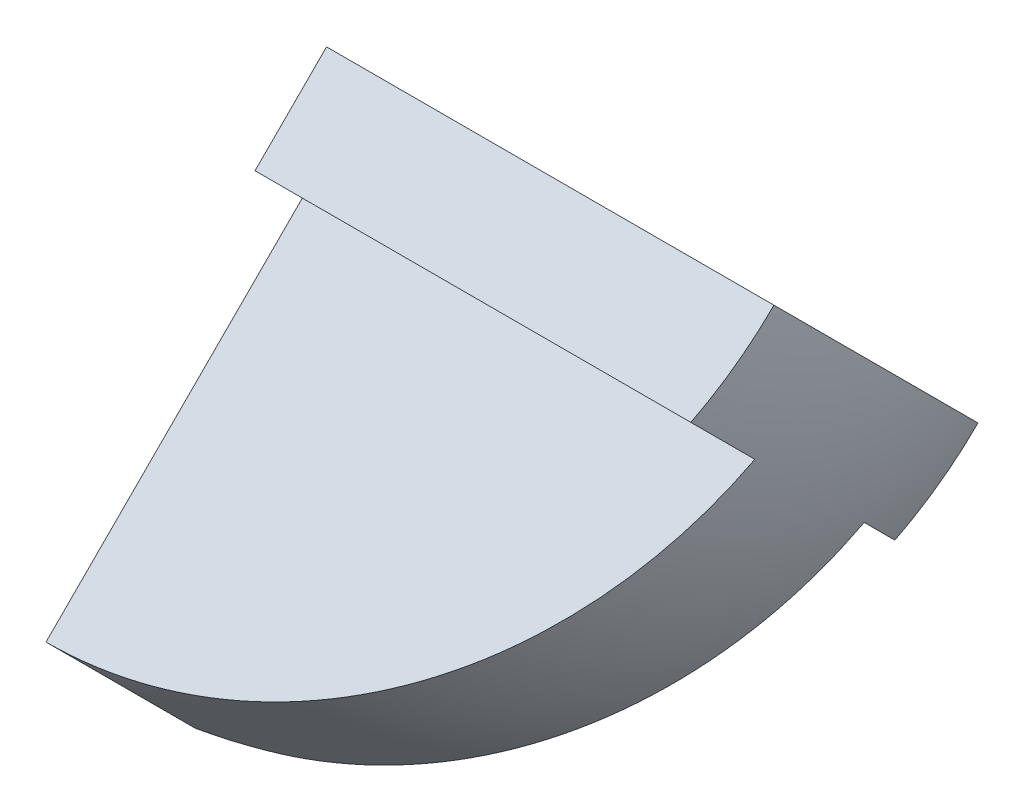
ISO-10303-21;
HEADER;
FILE_DESCRIPTION(('STEP AP214'),'2;1');
FILE_NAME('part.step','',(''),(''),'','','');
FILE_SCHEMA(('AUTOMOTIVE_DESIGN { 1 0 10303 214 1 1 1 1 }'));
ENDSEC;
DATA;
#1=APPLICATION_CONTEXT('core data for automotive mechanical design processes');
#2=APPLICATION_PROTOCOL_DEFINITION('international standard','automotive_design',2000,#1);
#3=PRODUCT_CONTEXT('',#1,'mechanical');
#4=PRODUCT('Part','Part','',(#3));
#5=PRODUCT_RELATED_PRODUCT_CATEGORY('part','',(#4));
#6=PRODUCT_DEFINITION_FORMATION('','',#4);
#7=PRODUCT_DEFINITION_CONTEXT('part definition',#1,'design');
#8=PRODUCT_DEFINITION('design','',#6,#7);
#9=PRODUCT_DEFINITION_SHAPE('','',#8);
#10=(LENGTH_UNIT() NAMED_UNIT(*) SI_UNIT(.MILLI.,.METRE.));
#11=(NAMED_UNIT(*) PLANE_ANGLE_UNIT() SI_UNIT($,.RADIAN.));
#12=(NAMED_UNIT(*) SI_UNIT($,.STERADIAN.) SOLID_ANGLE_UNIT());
#13=UNCERTAINTY_MEASURE_WITH_UNIT(LENGTH_MEASURE(1.E-05),#10,'distance_accuracy_value','');
#14=(GEOMETRIC_REPRESENTATION_CONTEXT(3) GLOBAL_UNCERTAINTY_ASSIGNED_CONTEXT((#13)) GLOBAL_UNIT_ASSIGNED_CONTEXT((#10,
#11,#12)) REPRESENTATION_CONTEXT('',''));
#15=CARTESIAN_POINT('',(0.,0.,0.));
#16=DIRECTION('',(0.,0.,1.));
#17=DIRECTION('',(1.,0.,0.));
#18=AXIS2_PLACEMENT_3D('',#15,#16,#17);
#19=CARTESIAN_POINT('',(-65.,-21.4342694425522,76.0704710401193));
#20=DIRECTION('',(0.,1.,0.));
#21=DIRECTION('',(0.,0.,-1.));
#22=AXIS2_PLACEMENT_3D('',#19,#20,#21);
#23=SPHERICAL_SURFACE('',#22,19.75);
#24=CARTESIAN_POINT('',(-65.,-24.4394732625951,79.0756748601621));
#25=DIRECTION('',(0.,0.707106781186554,-0.707106781186541));
#26=DIRECTION('',(0.,0.707106781186541,0.707106781186554));
#27=AXIS2_PLACEMENT_3D('',#24,#25,#26);
#28=CIRCLE('',#27,19.2873015219859);
#29=CARTESIAN_POINT('',(-45.9884903282249,-22.1413762237388,81.3737718990184));
#30=VERTEX_POINT('',#29);
#31=CARTESIAN_POINT('',(-46.6901665763994,-20.1528662127245,83.3622819100327));
#32=VERTEX_POINT('',#31);
#33=EDGE_CURVE('E127',#30,#32,#28,.F.);
#34=ORIENTED_EDGE('',*,*,#33,.F.);
#35=CARTESIAN_POINT('',(-65.,-19.136172403696,78.3685680789756));
#36=DIRECTION('',(0.,-0.707106781186544,-0.707106781186551));
#37=DIRECTION('',(0.,0.707106781186551,-0.707106781186544));
#38=AXIS2_PLACEMENT_3D('',#35,#36,#37);
#39=CIRCLE('',#38,19.4807597387782);
#40=CARTESIAN_POINT('',(-65.,-32.9111497176519,92.1435453929314));
#41=VERTEX_POINT('',#40);
#42=EDGE_CURVE('E176',#41,#30,#39,.F.);
#43=ORIENTED_EDGE('',*,*,#42,.F.);
#44=CARTESIAN_POINT('',(-65.,-35.2092467565082,89.8454483540751));
#45=DIRECTION('',(0.,0.707106781186551,-0.707106781186544));
#46=DIRECTION('',(0.,0.707106781186544,0.707106781186551));
#47=AXIS2_PLACEMENT_3D('',#44,#45,#46);
#48=CIRCLE('',#47,3.25000000000001);
#49=CARTESIAN_POINT('',(-65.,-37.5073437953645,87.5473513152188));
#50=VERTEX_POINT('',#49);
#51=EDGE_CURVE('E124',#50,#41,#48,.F.);
#52=ORIENTED_EDGE('',*,*,#51,.F.);
#53=CARTESIAN_POINT('',(-65.,-23.7323664814085,73.772374001263));
#54=DIRECTION('',(0.,0.707106781186544,0.707106781186551));
#55=DIRECTION('',(0.,-0.707106781186551,0.707106781186544));
#56=AXIS2_PLACEMENT_3D('',#53,#54,#55);
#57=CIRCLE('',#56,19.4807597387782);
#58=CARTESIAN_POINT('',(-45.9884903282249,-26.7375703014513,76.7775778213058));
#59=VERTEX_POINT('',#58);
#60=EDGE_CURVE('E171',#59,#50,#57,.F.);
#61=ORIENTED_EDGE('',*,*,#60,.F.);
#62=CARTESIAN_POINT('',(-65.,-24.4394732625951,79.0756748601621));
#63=DIRECTION('',(0.,0.70710678118655,-0.707106781186545));
#64=DIRECTION('',(0.,0.707106781186545,0.70710678118655));
#65=AXIS2_PLACEMENT_3D('',#62,#63,#64);
#66=CIRCLE('',#65,19.2873015219859);
#67=CARTESIAN_POINT('',(-46.6901665763995,-28.7260803124656,74.7890678102915));
#68=VERTEX_POINT('',#67);
#69=EDGE_CURVE('E169',#68,#59,#66,.F.);
#70=ORIENTED_EDGE('',*,*,#69,.F.);
#71=CARTESIAN_POINT('',(-65.,-25.7208764924228,71.7838639902487));
#72=DIRECTION('',(0.,0.707106781186543,0.707106781186551));
#73=DIRECTION('',(0.,-0.707106781186552,0.707106781186544));
#74=AXIS2_PLACEMENT_3D('',#71,#72,#73);
#75=CIRCLE('',#74,18.7966087366844);
#76=CARTESIAN_POINT('',(-46.2033912633156,-25.7208764924228,71.7838639902487));
#77=VERTEX_POINT('',#76);
#78=EDGE_CURVE('E167',#77,#68,#75,.F.);
#79=ORIENTED_EDGE('',*,*,#78,.F.);
#80=CARTESIAN_POINT('',(-65.,-21.4342694425522,76.0704710401193));
#81=DIRECTION('',(0.,-0.707106781186551,0.707106781186544));
#82=DIRECTION('',(0.,-0.707106781186544,-0.707106781186551));
#83=AXIS2_PLACEMENT_3D('',#80,#81,#82);
#84=CIRCLE('',#83,19.75);
#85=CARTESIAN_POINT('',(-46.2033912633156,-17.1476623926817,80.3570780899899));
#86=VERTEX_POINT('',#85);
#87=EDGE_CURVE('E160',#86,#77,#84,.F.);
#88=ORIENTED_EDGE('',*,*,#87,.F.);
#89=CARTESIAN_POINT('',(-65.,-17.1476623926817,80.3570780899899));
#90=DIRECTION('',(0.,-0.707106781186543,-0.707106781186551));
#91=DIRECTION('',(0.,0.707106781186552,-0.707106781186544));
#92=AXIS2_PLACEMENT_3D('',#89,#90,#91);
#93=CIRCLE('',#92,18.7966087366844);
#94=EDGE_CURVE('E173',#32,#86,#93,.F.);
#95=ORIENTED_EDGE('',*,*,#94,.F.);
#96=EDGE_LOOP('',(#34,#43,#52,#61,#70,#79,#88,#95));
#97=FACE_BOUND('',#96,.T.);
#98=ADVANCED_FACE('F33',(#97),#23,.T.);
#99=CARTESIAN_POINT('',(-65.,-41.1842694425523,95.8204710401192));
#100=DIRECTION('',(0.,0.707106781186551,-0.707106781186544));
#101=DIRECTION('',(0.,0.707106781186544,0.707106781186551));
#102=AXIS2_PLACEMENT_3D('',#99,#100,#101);
#103=CYLINDRICAL_SURFACE('',#102,3.25000000000001);
#104=DIRECTION('',(0.,0.707106781186551,-0.707106781186544));
#105=VECTOR('',#104,1.);
#106=CARTESIAN_POINT('',(-65.,-38.8861724036961,98.1185680789755));
#107=LINE('',#106,#105);
#108=CARTESIAN_POINT('',(-65.,-22.1413762237388,81.3737718990184));
#109=VERTEX_POINT('',#108);
#110=EDGE_CURVE('E36',#109,#41,#107,.F.);
#111=ORIENTED_EDGE('',*,*,#110,.F.);
#112=CARTESIAN_POINT('',(-65.,-24.4394732625951,79.0756748601621));
#113=DIRECTION('',(0.,0.707106781186552,-0.707106781186543));
#114=DIRECTION('',(0.,0.707106781186543,0.707106781186552));
#115=AXIS2_PLACEMENT_3D('',#112,#113,#114);
#116=CIRCLE('',#115,3.25000000000001);
#117=CARTESIAN_POINT('',(-65.,-26.7375703014513,76.7775778213058));
#118=VERTEX_POINT('',#117);
#119=EDGE_CURVE('E121',#109,#118,#116,.T.);
#120=ORIENTED_EDGE('',*,*,#119,.T.);
#121=DIRECTION('',(0.,0.707106781186551,-0.707106781186544));
#122=VECTOR('',#121,1.);
#123=CARTESIAN_POINT('',(-65.,-43.4823664814086,93.5223740012629));
#124=LINE('',#123,#122);
#125=EDGE_CURVE('E12',#118,#50,#124,.F.);
#126=ORIENTED_EDGE('',*,*,#125,.T.);
#127=ORIENTED_EDGE('',*,*,#51,.T.);
#128=EDGE_LOOP('',(#111,#120,#126,#127));
#129=FACE_BOUND('',#128,.T.);
#130=ADVANCED_FACE('F120',(#129),#103,.F.);
#131=CARTESIAN_POINT('',(0.,-51.7575740613788,51.7575740613781));
#132=DIRECTION('',(0.,0.707106781186552,-0.707106781186543));
#133=DIRECTION('',(0.,0.707106781186543,0.707106781186552));
#134=AXIS2_PLACEMENT_3D('',#131,#132,#133);
#135=PLANE('',#134);
#136=DIRECTION('',(-1.,0.,0.));
#137=VECTOR('',#136,1.);
#138=CARTESIAN_POINT('',(-45.25,-22.1413762237388,81.3737718990184));
#139=LINE('',#138,#137);
#140=CARTESIAN_POINT('',(-60.1291651245989,-22.1413762237388,81.3737718990184));
#141=VERTEX_POINT('',#140);
#142=EDGE_CURVE('E108',#141,#109,#139,.T.);
#143=ORIENTED_EDGE('',*,*,#142,.F.);
#144=DIRECTION('',(0.866025403784439,-0.353553390593271,-0.353553390593275));
#145=VECTOR('',#144,1.);
#146=CARTESIAN_POINT('',(-65.,-20.1528662127245,83.3622819100327));
#147=LINE('',#146,#145);
#148=CARTESIAN_POINT('',(-59.75,-22.2961697376598,81.2189783850974));
#149=VERTEX_POINT('',#148);
#150=EDGE_CURVE('E142',#141,#149,#147,.T.);
#151=ORIENTED_EDGE('',*,*,#150,.T.);
#152=DIRECTION('',(0.,-0.707106781186545,-0.70710678118655));
#153=VECTOR('',#152,1.);
#154=CARTESIAN_POINT('',(-59.75,-22.2961697376598,81.2189783850974));
#155=LINE('',#154,#153);
#156=CARTESIAN_POINT('',(-59.75,-26.5827767875304,76.9323713352268));
#157=VERTEX_POINT('',#156);
#158=EDGE_CURVE('E146',#149,#157,#155,.T.);
#159=ORIENTED_EDGE('',*,*,#158,.T.);
#160=DIRECTION('',(-0.866025403784439,-0.353553390593271,-0.353553390593277));
#161=VECTOR('',#160,1.);
#162=CARTESIAN_POINT('',(-59.75,-26.5827767875304,76.9323713352268));
#163=LINE('',#162,#161);
#164=CARTESIAN_POINT('',(-60.1291651245988,-26.7375703014513,76.7775778213058));
#165=VERTEX_POINT('',#164);
#166=EDGE_CURVE('E140',#157,#165,#163,.T.);
#167=ORIENTED_EDGE('',*,*,#166,.T.);
#168=DIRECTION('',(-1.,0.,0.));
#169=VECTOR('',#168,1.);
#170=CARTESIAN_POINT('',(-45.25,-26.7375703014513,76.7775778213058));
#171=LINE('',#170,#169);
#172=EDGE_CURVE('E130',#165,#118,#171,.T.);
#173=ORIENTED_EDGE('',*,*,#172,.T.);
#174=ORIENTED_EDGE('',*,*,#119,.F.);
#175=EDGE_LOOP('',(#143,#151,#159,#167,#173,#174));
#176=FACE_BOUND('',#175,.T.);
#177=ADVANCED_FACE('F128',(#176),#135,.T.);
#178=CARTESIAN_POINT('',(-59.75,-26.5827767875304,76.9323713352268));
#179=DIRECTION('',(0.5,-0.612372435695791,-0.612372435695798));
#180=DIRECTION('',(0.,0.707106781186551,-0.707106781186544));
#181=AXIS2_PLACEMENT_3D('',#178,#179,#180);
#182=PLANE('',#181);
#183=DIRECTION('',(-0.866025403784439,-0.353553390593271,-0.353553390593277));
#184=VECTOR('',#183,1.);
#185=CARTESIAN_POINT('',(-59.75,-23.5775729674875,73.927167515184));
#186=LINE('',#185,#184);
#187=CARTESIAN_POINT('',(-59.75,-23.5775729674875,73.927167515184));
#188=VERTEX_POINT('',#187);
#189=CARTESIAN_POINT('',(-65.,-25.7208764924228,71.7838639902487));
#190=VERTEX_POINT('',#189);
#191=EDGE_CURVE('E133',#188,#190,#186,.T.);
#192=ORIENTED_EDGE('',*,*,#191,.T.);
#193=DIRECTION('',(0.,0.707106781186551,-0.707106781186544));
#194=VECTOR('',#193,1.);
#195=CARTESIAN_POINT('',(-65.,-28.7260803124656,74.7890678102915));
#196=LINE('',#195,#194);
#197=CARTESIAN_POINT('',(-65.,-28.7260803124656,74.7890678102915));
#198=VERTEX_POINT('',#197);
#199=EDGE_CURVE('E41',#198,#190,#196,.T.);
#200=ORIENTED_EDGE('',*,*,#199,.F.);
#201=DIRECTION('',(0.866025403784439,0.353553390593273,0.353553390593275));
#202=VECTOR('',#201,1.);
#203=CARTESIAN_POINT('',(-59.75,-26.5827767875304,76.9323713352268));
#204=LINE('',#203,#202);
#205=EDGE_CURVE('E131',#198,#165,#204,.T.);
#206=ORIENTED_EDGE('',*,*,#205,.T.);
#207=ORIENTED_EDGE('',*,*,#166,.F.);
#208=DIRECTION('',(0.,0.707106781186551,-0.707106781186544));
#209=VECTOR('',#208,1.);
#210=CARTESIAN_POINT('',(-59.75,-26.5827767875304,76.9323713352268));
#211=LINE('',#210,#209);
#212=EDGE_CURVE('E157',#157,#188,#211,.T.);
#213=ORIENTED_EDGE('',*,*,#212,.T.);
#214=EDGE_LOOP('',(#192,#200,#206,#207,#213));
#215=FACE_BOUND('',#214,.T.);
#216=ADVANCED_FACE('F211',(#215),#182,.F.);
#217=CARTESIAN_POINT('',(-65.,-20.1528662127245,83.3622819100327));
#218=DIRECTION('',(0.499999999999999,0.612372435695791,0.612372435695798));
#219=DIRECTION('',(0.,-0.707106781186551,0.707106781186544));
#220=AXIS2_PLACEMENT_3D('',#217,#218,#219);
#221=PLANE('',#220);
#222=DIRECTION('',(0.866025403784439,-0.353553390593271,-0.353553390593275));
#223=VECTOR('',#222,1.);
#224=CARTESIAN_POINT('',(-65.,-17.1476623926817,80.3570780899899));
#225=LINE('',#224,#223);
#226=CARTESIAN_POINT('',(-65.,-17.1476623926817,80.3570780899899));
#227=VERTEX_POINT('',#226);
#228=CARTESIAN_POINT('',(-59.75,-19.290965917617,78.2137745650546));
#229=VERTEX_POINT('',#228);
#230=EDGE_CURVE('E152',#227,#229,#225,.T.);
#231=ORIENTED_EDGE('',*,*,#230,.T.);
#232=DIRECTION('',(0.,0.707106781186551,-0.707106781186544));
#233=VECTOR('',#232,1.);
#234=CARTESIAN_POINT('',(-59.75,-22.2961697376598,81.2189783850974));
#235=LINE('',#234,#233);
#236=EDGE_CURVE('E149',#149,#229,#235,.T.);
#237=ORIENTED_EDGE('',*,*,#236,.F.);
#238=ORIENTED_EDGE('',*,*,#150,.F.);
#239=CARTESIAN_POINT('',(-65.,-20.1528662127245,83.3622819100327));
#240=VERTEX_POINT('',#239);
#241=EDGE_CURVE('E144',#240,#141,#147,.T.);
#242=ORIENTED_EDGE('',*,*,#241,.F.);
#243=DIRECTION('',(0.,0.707106781186551,-0.707106781186544));
#244=VECTOR('',#243,1.);
#245=CARTESIAN_POINT('',(-65.,-20.1528662127245,83.3622819100327));
#246=LINE('',#245,#244);
#247=EDGE_CURVE('E126',#240,#227,#246,.T.);
#248=ORIENTED_EDGE('',*,*,#247,.T.);
#249=EDGE_LOOP('',(#231,#237,#238,#242,#248));
#250=FACE_BOUND('',#249,.T.);
#251=ADVANCED_FACE('F217',(#250),#221,.F.);
#252=CARTESIAN_POINT('',(-59.75,-22.2961697376598,81.2189783850974));
#253=DIRECTION('',(1.,0.,0.));
#254=DIRECTION('',(0.,0.,-1.));
#255=AXIS2_PLACEMENT_3D('',#252,#253,#254);
#256=PLANE('',#255);
#257=DIRECTION('',(0.,-0.707106781186545,-0.70710678118655));
#258=VECTOR('',#257,1.);
#259=CARTESIAN_POINT('',(-59.75,-19.290965917617,78.2137745650546));
#260=LINE('',#259,#258);
#261=EDGE_CURVE('E143',#229,#188,#260,.T.);
#262=ORIENTED_EDGE('',*,*,#261,.T.);
#263=ORIENTED_EDGE('',*,*,#212,.F.);
#264=ORIENTED_EDGE('',*,*,#158,.F.);
#265=ORIENTED_EDGE('',*,*,#236,.T.);
#266=EDGE_LOOP('',(#262,#263,#264,#265));
#267=FACE_BOUND('',#266,.T.);
#268=ADVANCED_FACE('F215',(#267),#256,.F.);
#269=CARTESIAN_POINT('',(-45.25,-17.1476623926817,80.3570780899899));
#270=DIRECTION('',(0.,-0.707106781186551,0.707106781186544));
#271=DIRECTION('',(0.,-0.707106781186544,-0.707106781186551));
#272=AXIS2_PLACEMENT_3D('',#269,#270,#271);
#273=PLANE('',#272);
#274=ORIENTED_EDGE('',*,*,#261,.F.);
#275=ORIENTED_EDGE('',*,*,#230,.F.);
#276=DIRECTION('',(-1.,0.,0.));
#277=VECTOR('',#276,1.);
#278=CARTESIAN_POINT('',(-45.25,-17.1476623926817,80.3570780899899));
#279=LINE('',#278,#277);
#280=EDGE_CURVE('E193',#86,#227,#279,.T.);
#281=ORIENTED_EDGE('',*,*,#280,.F.);
#282=ORIENTED_EDGE('',*,*,#87,.T.);
#283=DIRECTION('',(-1.,0.,0.));
#284=VECTOR('',#283,1.);
#285=CARTESIAN_POINT('',(-45.25,-25.7208764924228,71.7838639902487));
#286=LINE('',#285,#284);
#287=EDGE_CURVE('E54',#77,#190,#286,.T.);
#288=ORIENTED_EDGE('',*,*,#287,.T.);
#289=ORIENTED_EDGE('',*,*,#191,.F.);
#290=EDGE_LOOP('',(#274,#275,#281,#282,#288,#289));
#291=FACE_BOUND('',#290,.T.);
#292=ADVANCED_FACE('F192',(#291),#273,.F.);
#293=CARTESIAN_POINT('',(-45.25,-25.7208764924228,71.7838639902487));
#294=DIRECTION('',(0.,0.707106781186543,0.707106781186551));
#295=DIRECTION('',(0.,-0.707106781186552,0.707106781186544));
#296=AXIS2_PLACEMENT_3D('',#293,#294,#295);
#297=PLANE('',#296);
#298=ORIENTED_EDGE('',*,*,#78,.T.);
#299=DIRECTION('',(-1.,0.,0.));
#300=VECTOR('',#299,1.);
#301=CARTESIAN_POINT('',(-45.25,-28.7260803124656,74.7890678102915));
#302=LINE('',#301,#300);
#303=EDGE_CURVE('E199',#68,#198,#302,.T.);
#304=ORIENTED_EDGE('',*,*,#303,.T.);
#305=ORIENTED_EDGE('',*,*,#199,.T.);
#306=ORIENTED_EDGE('',*,*,#287,.F.);
#307=EDGE_LOOP('',(#298,#304,#305,#306));
#308=FACE_BOUND('',#307,.T.);
#309=ADVANCED_FACE('F195',(#308),#297,.F.);
#310=CARTESIAN_POINT('',(-45.25,-28.7260803124656,74.7890678102915));
#311=DIRECTION('',(0.,0.70710678118655,-0.707106781186545));
#312=DIRECTION('',(0.,0.707106781186545,0.70710678118655));
#313=AXIS2_PLACEMENT_3D('',#310,#311,#312);
#314=PLANE('',#313);
#315=ORIENTED_EDGE('',*,*,#303,.F.);
#316=ORIENTED_EDGE('',*,*,#69,.T.);
#317=EDGE_CURVE('E117',#59,#165,#171,.T.);
#318=ORIENTED_EDGE('',*,*,#317,.T.);
#319=ORIENTED_EDGE('',*,*,#205,.F.);
#320=EDGE_LOOP('',(#315,#316,#318,#319));
#321=FACE_BOUND('',#320,.T.);
#322=ADVANCED_FACE('F207',(#321),#314,.F.);
#323=CARTESIAN_POINT('',(-45.25,-26.7375703014513,76.7775778213058));
#324=DIRECTION('',(0.,0.707106781186544,0.707106781186551));
#325=DIRECTION('',(0.,-0.707106781186551,0.707106781186544));
#326=AXIS2_PLACEMENT_3D('',#323,#324,#325);
#327=PLANE('',#326);
#328=ORIENTED_EDGE('',*,*,#60,.T.);
#329=ORIENTED_EDGE('',*,*,#125,.F.);
#330=ORIENTED_EDGE('',*,*,#172,.F.);
#331=ORIENTED_EDGE('',*,*,#317,.F.);
#332=EDGE_LOOP('',(#328,#329,#330,#331));
#333=FACE_BOUND('',#332,.T.);
#334=ADVANCED_FACE('F241',(#333),#327,.F.);
#335=CARTESIAN_POINT('',(-45.25,-32.9111497176519,92.1435453929314));
#336=DIRECTION('',(0.,-0.707106781186544,-0.707106781186551));
#337=DIRECTION('',(0.,0.707106781186551,-0.707106781186544));
#338=AXIS2_PLACEMENT_3D('',#335,#336,#337);
#339=PLANE('',#338);
#340=ORIENTED_EDGE('',*,*,#42,.T.);
#341=EDGE_CURVE('E113',#30,#141,#139,.T.);
#342=ORIENTED_EDGE('',*,*,#341,.T.);
#343=ORIENTED_EDGE('',*,*,#142,.T.);
#344=ORIENTED_EDGE('',*,*,#110,.T.);
#345=EDGE_LOOP('',(#340,#342,#343,#344));
#346=FACE_BOUND('',#345,.T.);
#347=ADVANCED_FACE('F110',(#346),#339,.F.);
#348=CARTESIAN_POINT('',(-45.25,-22.1413762237388,81.3737718990184));
#349=DIRECTION('',(0.,0.707106781186554,-0.707106781186541));
#350=DIRECTION('',(0.,0.707106781186541,0.707106781186554));
#351=AXIS2_PLACEMENT_3D('',#348,#349,#350);
#352=PLANE('',#351);
#353=ORIENTED_EDGE('',*,*,#341,.F.);
#354=ORIENTED_EDGE('',*,*,#33,.T.);
#355=DIRECTION('',(-1.,0.,0.));
#356=VECTOR('',#355,1.);
#357=CARTESIAN_POINT('',(-45.25,-20.1528662127245,83.3622819100327));
#358=LINE('',#357,#356);
#359=EDGE_CURVE('E136',#32,#240,#358,.T.);
#360=ORIENTED_EDGE('',*,*,#359,.T.);
#361=ORIENTED_EDGE('',*,*,#241,.T.);
#362=EDGE_LOOP('',(#353,#354,#360,#361));
#363=FACE_BOUND('',#362,.T.);
#364=ADVANCED_FACE('F181',(#363),#352,.F.);
#365=CARTESIAN_POINT('',(-45.25,-20.1528662127245,83.3622819100327));
#366=DIRECTION('',(0.,-0.707106781186543,-0.707106781186551));
#367=DIRECTION('',(0.,0.707106781186552,-0.707106781186544));
#368=AXIS2_PLACEMENT_3D('',#365,#366,#367);
#369=PLANE('',#368);
#370=ORIENTED_EDGE('',*,*,#94,.T.);
#371=ORIENTED_EDGE('',*,*,#280,.T.);
#372=ORIENTED_EDGE('',*,*,#247,.F.);
#373=ORIENTED_EDGE('',*,*,#359,.F.);
#374=EDGE_LOOP('',(#370,#371,#372,#373));
#375=FACE_BOUND('',#374,.T.);
#376=ADVANCED_FACE('F186',(#375),#369,.F.);
#377=CLOSED_SHELL('',(#98,#130,#177,#216,#251,#268,#292,#309,#322,#334,#347,#364,#376));
#378=MANIFOLD_SOLID_BREP('B2',#377);
#379=ADVANCED_BREP_SHAPE_REPRESENTATION('',(#18,#378),#14);
#380=SHAPE_DEFINITION_REPRESENTATION(#9,#379);
ENDSEC;
END-ISO-10303-21;
